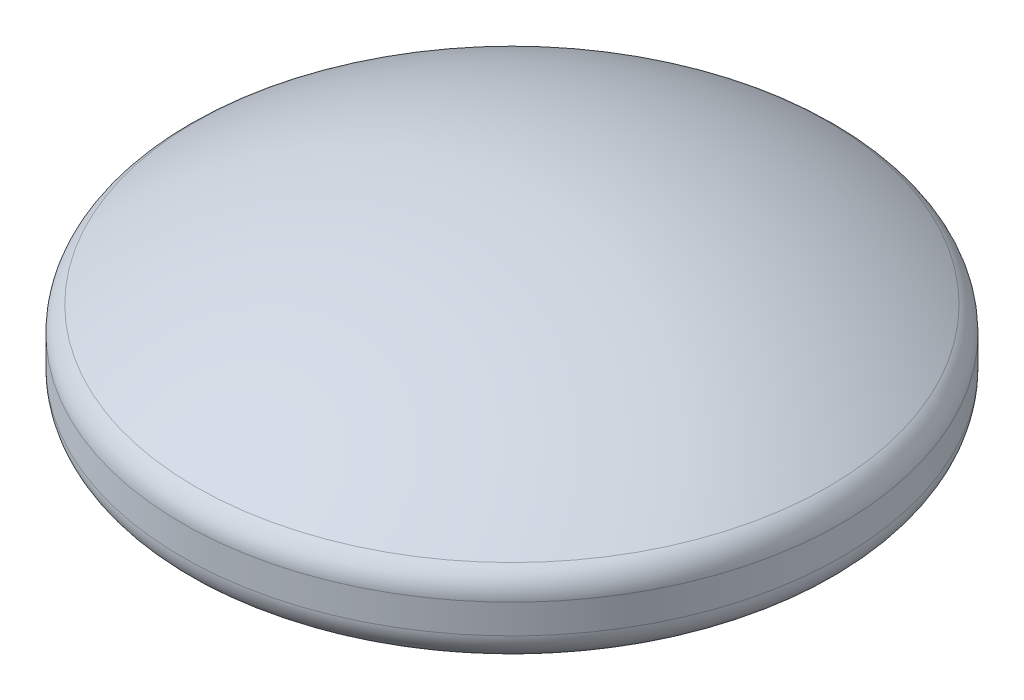
ISO-10303-21;
HEADER;
FILE_DESCRIPTION(('STEP AP214'),'2;1');
FILE_NAME('part.step','',(''),(''),'','','');
FILE_SCHEMA(('AUTOMOTIVE_DESIGN { 1 0 10303 214 1 1 1 1 }'));
ENDSEC;
DATA;
#1=APPLICATION_CONTEXT('core data for automotive mechanical design processes');
#2=APPLICATION_PROTOCOL_DEFINITION('international standard','automotive_design',2000,#1);
#3=PRODUCT_CONTEXT('',#1,'mechanical');
#4=PRODUCT('Part','Part','',(#3));
#5=PRODUCT_RELATED_PRODUCT_CATEGORY('part','',(#4));
#6=PRODUCT_DEFINITION_FORMATION('','',#4);
#7=PRODUCT_DEFINITION_CONTEXT('part definition',#1,'design');
#8=PRODUCT_DEFINITION('design','',#6,#7);
#9=PRODUCT_DEFINITION_SHAPE('','',#8);
#10=(LENGTH_UNIT() NAMED_UNIT(*) SI_UNIT(.MILLI.,.METRE.));
#11=(NAMED_UNIT(*) PLANE_ANGLE_UNIT() SI_UNIT($,.RADIAN.));
#12=(NAMED_UNIT(*) SI_UNIT($,.STERADIAN.) SOLID_ANGLE_UNIT());
#13=UNCERTAINTY_MEASURE_WITH_UNIT(LENGTH_MEASURE(1.E-05),#10,'distance_accuracy_value','');
#14=(GEOMETRIC_REPRESENTATION_CONTEXT(3) GLOBAL_UNCERTAINTY_ASSIGNED_CONTEXT((#13)) GLOBAL_UNIT_ASSIGNED_CONTEXT((#10,
#11,#12)) REPRESENTATION_CONTEXT('',''));
#15=CARTESIAN_POINT('',(0.,0.,0.));
#16=DIRECTION('',(0.,0.,1.));
#17=DIRECTION('',(1.,0.,0.));
#18=AXIS2_PLACEMENT_3D('',#15,#16,#17);
#19=CARTESIAN_POINT('',(0.,-31.5867142857143,0.));
#20=DIRECTION('',(0.,-1.,0.));
#21=DIRECTION('',(0.,0.,-1.));
#22=AXIS2_PLACEMENT_3D('',#19,#20,#21);
#23=SPHERICAL_SURFACE('',#22,48.3507142857143);
#24=CARTESIAN_POINT('',(0.,8.65139850043498,0.));
#25=DIRECTION('',(0.,-1.,0.));
#26=DIRECTION('',(0.,0.,-1.));
#27=AXIS2_PLACEMENT_3D('',#24,#25,#26);
#28=CIRCLE('',#27,26.8083168316832);
#29=CARTESIAN_POINT('',(0.,8.65139850043498,-26.8083168316832));
#30=VERTEX_POINT('',#29);
#31=EDGE_CURVE('E10',#30,#30,#28,.F.);
#32=ORIENTED_EDGE('',*,*,#31,.T.);
#33=EDGE_LOOP('',(#32));
#34=FACE_BOUND('',#33,.T.);
#35=ADVANCED_FACE('F43',(#34),#23,.T.);
#36=CARTESIAN_POINT('',(0.,3.81,0.));
#37=DIRECTION('',(0.,-1.,0.));
#38=DIRECTION('',(0.,0.,-1.));
#39=AXIS2_PLACEMENT_3D('',#36,#37,#38);
#40=PLANE('',#39);
#41=CARTESIAN_POINT('',(0.,3.81,0.));
#42=DIRECTION('',(0.,-1.,0.));
#43=DIRECTION('',(0.,0.,-1.));
#44=AXIS2_PLACEMENT_3D('',#41,#42,#43);
#45=CIRCLE('',#44,9.906);
#46=CARTESIAN_POINT('',(0.,3.81,-9.906));
#47=VERTEX_POINT('',#46);
#48=EDGE_CURVE('E67',#47,#47,#45,.T.);
#49=ORIENTED_EDGE('',*,*,#48,.T.);
#50=EDGE_LOOP('',(#49));
#51=FACE_BOUND('',#50,.T.);
#52=ADVANCED_FACE('F101',(#51),#40,.T.);
#53=CARTESIAN_POINT('',(0.,3.81,0.));
#54=DIRECTION('',(0.,-1.,0.));
#55=DIRECTION('',(0.,0.,-1.));
#56=AXIS2_PLACEMENT_3D('',#53,#54,#55);
#57=CYLINDRICAL_SURFACE('',#56,9.906);
#58=CARTESIAN_POINT('',(0.,0.,0.));
#59=DIRECTION('',(0.,-1.,0.));
#60=DIRECTION('',(0.,0.,-1.));
#61=AXIS2_PLACEMENT_3D('',#58,#59,#60);
#62=CIRCLE('',#61,9.906);
#63=CARTESIAN_POINT('',(0.,0.,-9.906));
#64=VERTEX_POINT('',#63);
#65=EDGE_CURVE('E71',#64,#64,#62,.T.);
#66=ORIENTED_EDGE('',*,*,#65,.T.);
#67=EDGE_LOOP('',(#66));
#68=FACE_BOUND('',#67,.T.);
#69=ORIENTED_EDGE('',*,*,#48,.F.);
#70=EDGE_LOOP('',(#69));
#71=FACE_BOUND('',#70,.T.);
#72=ADVANCED_FACE('F105',(#68,#71),#57,.F.);
#73=CARTESIAN_POINT('',(0.,0.,-9.906));
#74=DIRECTION('',(0.,-1.,0.));
#75=DIRECTION('',(0.,0.,-1.));
#76=AXIS2_PLACEMENT_3D('',#73,#74,#75);
#77=PLANE('',#76);
#78=CARTESIAN_POINT('',(0.,0.,0.));
#79=DIRECTION('',(0.,-1.,0.));
#80=DIRECTION('',(0.,0.,-1.));
#81=AXIS2_PLACEMENT_3D('',#78,#79,#80);
#82=CIRCLE('',#81,20.32);
#83=CARTESIAN_POINT('',(0.,0.,-20.32));
#84=VERTEX_POINT('',#83);
#85=EDGE_CURVE('E75',#84,#84,#82,.T.);
#86=ORIENTED_EDGE('',*,*,#85,.T.);
#87=EDGE_LOOP('',(#86));
#88=FACE_BOUND('',#87,.T.);
#89=ORIENTED_EDGE('',*,*,#65,.F.);
#90=EDGE_LOOP('',(#89));
#91=FACE_BOUND('',#90,.T.);
#92=ADVANCED_FACE('F99',(#88,#91),#77,.T.);
#93=CARTESIAN_POINT('',(0.,3.81,0.));
#94=DIRECTION('',(0.,-1.,0.));
#95=DIRECTION('',(0.,0.,-1.));
#96=AXIS2_PLACEMENT_3D('',#93,#94,#95);
#97=CYLINDRICAL_SURFACE('',#96,20.32);
#98=CARTESIAN_POINT('',(0.,1.524,0.));
#99=DIRECTION('',(0.,-1.,0.));
#100=DIRECTION('',(0.,0.,-1.));
#101=AXIS2_PLACEMENT_3D('',#98,#99,#100);
#102=CIRCLE('',#101,20.32);
#103=CARTESIAN_POINT('',(0.,1.524,-20.32));
#104=VERTEX_POINT('',#103);
#105=EDGE_CURVE('E79',#104,#104,#102,.T.);
#106=ORIENTED_EDGE('',*,*,#105,.T.);
#107=EDGE_LOOP('',(#106));
#108=FACE_BOUND('',#107,.T.);
#109=ORIENTED_EDGE('',*,*,#85,.F.);
#110=EDGE_LOOP('',(#109));
#111=FACE_BOUND('',#110,.T.);
#112=ADVANCED_FACE('F84',(#108,#111),#97,.T.);
#113=CARTESIAN_POINT('',(0.,1.524,-20.32));
#114=DIRECTION('',(0.,-1.,0.));
#115=DIRECTION('',(0.,0.,-1.));
#116=AXIS2_PLACEMENT_3D('',#113,#114,#115);
#117=PLANE('',#116);
#118=CARTESIAN_POINT('',(0.,1.524,0.));
#119=DIRECTION('',(0.,-1.,0.));
#120=DIRECTION('',(0.,0.,-1.));
#121=AXIS2_PLACEMENT_3D('',#118,#119,#120);
#122=CIRCLE('',#121,25.4);
#123=CARTESIAN_POINT('',(0.,1.524,-25.4));
#124=VERTEX_POINT('',#123);
#125=EDGE_CURVE('E62',#124,#124,#122,.T.);
#126=ORIENTED_EDGE('',*,*,#125,.T.);
#127=EDGE_LOOP('',(#126));
#128=FACE_BOUND('',#127,.T.);
#129=ORIENTED_EDGE('',*,*,#105,.F.);
#130=EDGE_LOOP('',(#129));
#131=FACE_BOUND('',#130,.T.);
#132=ADVANCED_FACE('F87',(#128,#131),#117,.T.);
#133=CARTESIAN_POINT('',(0.,3.81,0.));
#134=DIRECTION('',(0.,-1.,0.));
#135=DIRECTION('',(0.,0.,-1.));
#136=AXIS2_PLACEMENT_3D('',#133,#134,#135);
#137=CYLINDRICAL_SURFACE('',#136,27.94);
#138=CARTESIAN_POINT('',(0.,4.064,0.));
#139=DIRECTION('',(0.,-1.,0.));
#140=DIRECTION('',(0.,0.,-1.));
#141=AXIS2_PLACEMENT_3D('',#138,#139,#140);
#142=CIRCLE('',#141,27.94);
#143=CARTESIAN_POINT('',(0.,4.064,-27.94));
#144=VERTEX_POINT('',#143);
#145=EDGE_CURVE('E51',#144,#144,#142,.F.);
#146=ORIENTED_EDGE('',*,*,#145,.T.);
#147=EDGE_LOOP('',(#146));
#148=FACE_BOUND('',#147,.T.);
#149=CARTESIAN_POINT('',(0.,6.5375764403746,0.));
#150=DIRECTION('',(0.,-1.,0.));
#151=DIRECTION('',(0.,0.,-1.));
#152=AXIS2_PLACEMENT_3D('',#149,#150,#151);
#153=CIRCLE('',#152,27.94);
#154=CARTESIAN_POINT('',(0.,6.5375764403746,-27.94));
#155=VERTEX_POINT('',#154);
#156=EDGE_CURVE('E58',#155,#155,#153,.T.);
#157=ORIENTED_EDGE('',*,*,#156,.T.);
#158=EDGE_LOOP('',(#157));
#159=FACE_BOUND('',#158,.T.);
#160=ADVANCED_FACE('F89',(#148,#159),#137,.T.);
#161=CARTESIAN_POINT('',(0.,4.064,0.));
#162=DIRECTION('',(0.,-1.,0.));
#163=DIRECTION('',(0.,0.,-1.));
#164=AXIS2_PLACEMENT_3D('',#161,#162,#163);
#165=TOROIDAL_SURFACE('',#164,25.4,2.54);
#166=ORIENTED_EDGE('',*,*,#145,.F.);
#167=EDGE_LOOP('',(#166));
#168=FACE_BOUND('',#167,.T.);
#169=ORIENTED_EDGE('',*,*,#125,.F.);
#170=EDGE_LOOP('',(#169));
#171=FACE_BOUND('',#170,.T.);
#172=ADVANCED_FACE('F96',(#168,#171),#165,.T.);
#173=CARTESIAN_POINT('',(0.,6.5375764403746,0.));
#174=DIRECTION('',(0.,-1.,0.));
#175=DIRECTION('',(0.,0.,-1.));
#176=AXIS2_PLACEMENT_3D('',#173,#174,#175);
#177=TOROIDAL_SURFACE('',#176,25.4,2.54);
#178=ORIENTED_EDGE('',*,*,#31,.F.);
#179=EDGE_LOOP('',(#178));
#180=FACE_BOUND('',#179,.T.);
#181=ORIENTED_EDGE('',*,*,#156,.F.);
#182=EDGE_LOOP('',(#181));
#183=FACE_BOUND('',#182,.T.);
#184=ADVANCED_FACE('F45',(#180,#183),#177,.T.);
#185=CLOSED_SHELL('',(#35,#52,#72,#92,#112,#132,#160,#172,#184));
#186=MANIFOLD_SOLID_BREP('B2',#185);
#187=ADVANCED_BREP_SHAPE_REPRESENTATION('',(#18,#186),#14);
#188=SHAPE_DEFINITION_REPRESENTATION(#9,#187);
ENDSEC;
END-ISO-10303-21;
